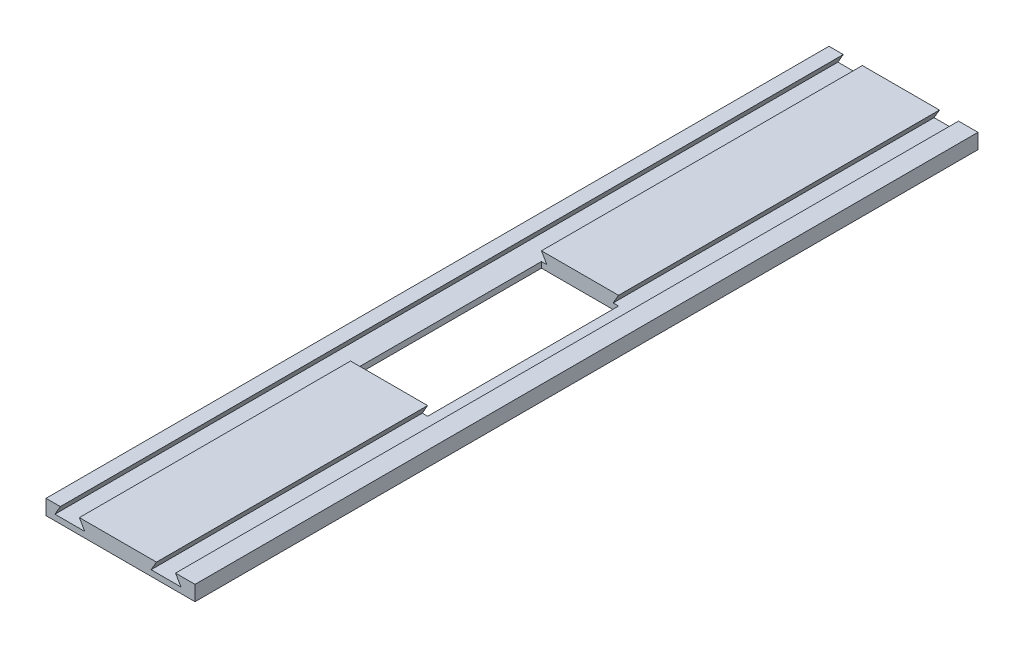
ISO-10303-21;
HEADER;
FILE_DESCRIPTION(('STEP AP214'),'2;1');
FILE_NAME('part.step','',(''),(''),'','','');
FILE_SCHEMA(('AUTOMOTIVE_DESIGN { 1 0 10303 214 1 1 1 1 }'));
ENDSEC;
DATA;
#1=APPLICATION_CONTEXT('core data for automotive mechanical design processes');
#2=APPLICATION_PROTOCOL_DEFINITION('international standard','automotive_design',2000,#1);
#3=PRODUCT_CONTEXT('',#1,'mechanical');
#4=PRODUCT('Part','Part','',(#3));
#5=PRODUCT_RELATED_PRODUCT_CATEGORY('part','',(#4));
#6=PRODUCT_DEFINITION_FORMATION('','',#4);
#7=PRODUCT_DEFINITION_CONTEXT('part definition',#1,'design');
#8=PRODUCT_DEFINITION('design','',#6,#7);
#9=PRODUCT_DEFINITION_SHAPE('','',#8);
#10=(LENGTH_UNIT() NAMED_UNIT(*) SI_UNIT(.MILLI.,.METRE.));
#11=(NAMED_UNIT(*) PLANE_ANGLE_UNIT() SI_UNIT($,.RADIAN.));
#12=(NAMED_UNIT(*) SI_UNIT($,.STERADIAN.) SOLID_ANGLE_UNIT());
#13=UNCERTAINTY_MEASURE_WITH_UNIT(LENGTH_MEASURE(1.E-05),#10,'distance_accuracy_value','');
#14=(GEOMETRIC_REPRESENTATION_CONTEXT(3) GLOBAL_UNCERTAINTY_ASSIGNED_CONTEXT((#13)) GLOBAL_UNIT_ASSIGNED_CONTEXT((#10,
#11,#12)) REPRESENTATION_CONTEXT('',''));
#15=CARTESIAN_POINT('',(0.,0.,0.));
#16=DIRECTION('',(0.,0.,1.));
#17=DIRECTION('',(1.,0.,0.));
#18=AXIS2_PLACEMENT_3D('',#15,#16,#17);
#19=CARTESIAN_POINT('',(-1225.05220386916,883.863170125017,150.));
#20=DIRECTION('',(-0.866025403784422,0.500000000000028,0.));
#21=DIRECTION('',(-0.500000000000028,-0.866025403784423,0.));
#22=AXIS2_PLACEMENT_3D('',#19,#20,#21);
#23=PLANE('',#22);
#24=DIRECTION('',(0.,0.,-1.));
#25=VECTOR('',#24,1.);
#26=CARTESIAN_POINT('',(-1224.15220386916,885.422015851829,150.));
#27=LINE('',#26,#25);
#28=CARTESIAN_POINT('',(-1224.15220386916,885.422015851829,53.8357045726677));
#29=VERTEX_POINT('',#28);
#30=CARTESIAN_POINT('',(-1224.15220386916,885.422015851829,0.));
#31=VERTEX_POINT('',#30);
#32=EDGE_CURVE('E211',#29,#31,#27,.T.);
#33=ORIENTED_EDGE('',*,*,#32,.F.);
#34=DIRECTION('',(-0.500000000000028,-0.866025403784423,0.));
#35=VECTOR('',#34,1.);
#36=CARTESIAN_POINT('',(-1225.05220386916,883.863170125017,53.8357045726677));
#37=LINE('',#36,#35);
#38=CARTESIAN_POINT('',(-1225.05220386916,883.863170125017,53.8357045726677));
#39=VERTEX_POINT('',#38);
#40=EDGE_CURVE('E273',#29,#39,#37,.T.);
#41=ORIENTED_EDGE('',*,*,#40,.T.);
#42=DIRECTION('',(0.,0.,-1.));
#43=VECTOR('',#42,1.);
#44=CARTESIAN_POINT('',(-1225.05220386916,883.863170125017,150.));
#45=LINE('',#44,#43);
#46=CARTESIAN_POINT('',(-1225.05220386916,883.863170125017,0.));
#47=VERTEX_POINT('',#46);
#48=EDGE_CURVE('E214',#39,#47,#45,.T.);
#49=ORIENTED_EDGE('',*,*,#48,.T.);
#50=DIRECTION('',(0.500000000000028,0.866025403784422,0.));
#51=VECTOR('',#50,1.);
#52=CARTESIAN_POINT('',(-1225.05220386916,883.863170125017,0.));
#53=LINE('',#52,#51);
#54=EDGE_CURVE('E299',#47,#31,#53,.T.);
#55=ORIENTED_EDGE('',*,*,#54,.T.);
#56=EDGE_LOOP('',(#33,#41,#49,#55));
#57=FACE_BOUND('',#56,.T.);
#58=ADVANCED_FACE('F39',(#57),#23,.F.);
#59=CARTESIAN_POINT('',(-1237.08617846537,885.422015851829,150.));
#60=DIRECTION('',(0.,-1.,0.));
#61=DIRECTION('',(0.,0.,-1.));
#62=AXIS2_PLACEMENT_3D('',#59,#60,#61);
#63=PLANE('',#62);
#64=DIRECTION('',(0.,0.,-1.));
#65=VECTOR('',#64,1.);
#66=CARTESIAN_POINT('',(-1237.08617846537,885.422015851829,150.));
#67=LINE('',#66,#65);
#68=CARTESIAN_POINT('',(-1237.08617846537,885.422015851829,53.8357045726677));
#69=VERTEX_POINT('',#68);
#70=CARTESIAN_POINT('',(-1237.08617846537,885.422015851829,0.));
#71=VERTEX_POINT('',#70);
#72=EDGE_CURVE('E208',#69,#71,#67,.T.);
#73=ORIENTED_EDGE('',*,*,#72,.F.);
#74=DIRECTION('',(-1.,0.,0.));
#75=VECTOR('',#74,1.);
#76=CARTESIAN_POINT('',(-1237.08617846537,885.422015851829,53.8357045726677));
#77=LINE('',#76,#75);
#78=EDGE_CURVE('E254',#29,#69,#77,.T.);
#79=ORIENTED_EDGE('',*,*,#78,.F.);
#80=ORIENTED_EDGE('',*,*,#32,.T.);
#81=DIRECTION('',(-1.,0.,0.));
#82=VECTOR('',#81,1.);
#83=CARTESIAN_POINT('',(-1237.08617846537,885.422015851829,0.));
#84=LINE('',#83,#82);
#85=EDGE_CURVE('E302',#31,#71,#84,.T.);
#86=ORIENTED_EDGE('',*,*,#85,.T.);
#87=EDGE_LOOP('',(#73,#79,#80,#86));
#88=FACE_BOUND('',#87,.T.);
#89=ADVANCED_FACE('F358',(#88),#63,.F.);
#90=CARTESIAN_POINT('',(-1236.18617846537,883.863170125017,150.));
#91=DIRECTION('',(0.866025403784422,0.500000000000028,0.));
#92=DIRECTION('',(-0.500000000000028,0.866025403784423,0.));
#93=AXIS2_PLACEMENT_3D('',#90,#91,#92);
#94=PLANE('',#93);
#95=DIRECTION('',(0.,0.,-1.));
#96=VECTOR('',#95,1.);
#97=CARTESIAN_POINT('',(-1236.18617846537,883.863170125017,150.));
#98=LINE('',#97,#96);
#99=CARTESIAN_POINT('',(-1236.18617846537,883.863170125017,53.8357045726677));
#100=VERTEX_POINT('',#99);
#101=CARTESIAN_POINT('',(-1236.18617846537,883.863170125017,0.));
#102=VERTEX_POINT('',#101);
#103=EDGE_CURVE('E205',#100,#102,#98,.T.);
#104=ORIENTED_EDGE('',*,*,#103,.F.);
#105=DIRECTION('',(-0.500000000000028,0.866025403784423,0.));
#106=VECTOR('',#105,1.);
#107=CARTESIAN_POINT('',(-1236.18617846537,883.863170125017,53.8357045726677));
#108=LINE('',#107,#106);
#109=EDGE_CURVE('E270',#100,#69,#108,.T.);
#110=ORIENTED_EDGE('',*,*,#109,.T.);
#111=ORIENTED_EDGE('',*,*,#72,.T.);
#112=DIRECTION('',(0.500000000000028,-0.866025403784422,0.));
#113=VECTOR('',#112,1.);
#114=CARTESIAN_POINT('',(-1236.18617846537,883.863170125017,0.));
#115=LINE('',#114,#113);
#116=EDGE_CURVE('E305',#71,#102,#115,.T.);
#117=ORIENTED_EDGE('',*,*,#116,.T.);
#118=EDGE_LOOP('',(#104,#110,#111,#117));
#119=FACE_BOUND('',#118,.T.);
#120=ADVANCED_FACE('F357',(#119),#94,.F.);
#121=CARTESIAN_POINT('',(-1242.68617846537,885.422015851829,150.));
#122=DIRECTION('',(1.,0.,0.));
#123=DIRECTION('',(0.,0.,-1.));
#124=AXIS2_PLACEMENT_3D('',#121,#122,#123);
#125=PLANE('',#124);
#126=DIRECTION('',(0.,0.,-1.));
#127=VECTOR('',#126,1.);
#128=CARTESIAN_POINT('',(-1242.68617846537,882.893470026503,150.));
#129=LINE('',#128,#127);
#130=CARTESIAN_POINT('',(-1242.68617846537,882.893470026503,131.36));
#131=VERTEX_POINT('',#130);
#132=CARTESIAN_POINT('',(-1242.68617846537,882.893470026503,0.));
#133=VERTEX_POINT('',#132);
#134=EDGE_CURVE('E189',#131,#133,#129,.T.);
#135=ORIENTED_EDGE('',*,*,#134,.F.);
#136=DIRECTION('',(0.,-1.,0.));
#137=VECTOR('',#136,1.);
#138=CARTESIAN_POINT('',(-1242.68617846537,885.422015851829,131.36));
#139=LINE('',#138,#137);
#140=CARTESIAN_POINT('',(-1242.68617846537,885.422015851829,131.36));
#141=VERTEX_POINT('',#140);
#142=EDGE_CURVE('E176',#141,#131,#139,.T.);
#143=ORIENTED_EDGE('',*,*,#142,.F.);
#144=DIRECTION('',(0.,0.,-1.));
#145=VECTOR('',#144,1.);
#146=CARTESIAN_POINT('',(-1242.68617846537,885.422015851829,150.));
#147=LINE('',#146,#145);
#148=CARTESIAN_POINT('',(-1242.68617846537,885.422015851829,0.));
#149=VERTEX_POINT('',#148);
#150=EDGE_CURVE('E187',#141,#149,#147,.T.);
#151=ORIENTED_EDGE('',*,*,#150,.T.);
#152=DIRECTION('',(0.,-1.,0.));
#153=VECTOR('',#152,1.);
#154=CARTESIAN_POINT('',(-1242.68617846537,885.422015851829,0.));
#155=LINE('',#154,#153);
#156=EDGE_CURVE('E282',#149,#133,#155,.T.);
#157=ORIENTED_EDGE('',*,*,#156,.T.);
#158=EDGE_LOOP('',(#135,#143,#151,#157));
#159=FACE_BOUND('',#158,.T.);
#160=ADVANCED_FACE('F41',(#159),#125,.F.);
#161=CARTESIAN_POINT('',(-1242.68617846537,882.893470026503,150.));
#162=DIRECTION('',(0.,1.,0.));
#163=DIRECTION('',(0.,0.,1.));
#164=AXIS2_PLACEMENT_3D('',#161,#162,#163);
#165=PLANE('',#164);
#166=DIRECTION('',(1.,0.,0.));
#167=VECTOR('',#166,1.);
#168=CARTESIAN_POINT('',(-1237.08617846537,882.893470026503,53.8357045726677));
#169=LINE('',#168,#167);
#170=CARTESIAN_POINT('',(-1237.08617846537,882.893470026503,53.8357045726677));
#171=VERTEX_POINT('',#170);
#172=CARTESIAN_POINT('',(-1224.15220386916,882.893470026503,53.8357045726677));
#173=VERTEX_POINT('',#172);
#174=EDGE_CURVE('E249',#171,#173,#169,.T.);
#175=ORIENTED_EDGE('',*,*,#174,.F.);
#176=DIRECTION('',(0.,0.,-1.));
#177=VECTOR('',#176,1.);
#178=CARTESIAN_POINT('',(-1237.08617846537,882.893470026503,85.8684548246354));
#179=LINE('',#178,#177);
#180=CARTESIAN_POINT('',(-1237.08617846537,882.893470026503,85.8684548246354));
#181=VERTEX_POINT('',#180);
#182=EDGE_CURVE('E243',#181,#171,#179,.T.);
#183=ORIENTED_EDGE('',*,*,#182,.F.);
#184=DIRECTION('',(-1.,0.,0.));
#185=VECTOR('',#184,1.);
#186=CARTESIAN_POINT('',(-1224.15220386916,882.893470026503,85.8684548246354));
#187=LINE('',#186,#185);
#188=CARTESIAN_POINT('',(-1224.15220386916,882.893470026503,85.8684548246354));
#189=VERTEX_POINT('',#188);
#190=EDGE_CURVE('E259',#189,#181,#187,.T.);
#191=ORIENTED_EDGE('',*,*,#190,.F.);
#192=DIRECTION('',(0.,0.,1.));
#193=VECTOR('',#192,1.);
#194=CARTESIAN_POINT('',(-1224.15220386916,882.893470026503,53.8357045726677));
#195=LINE('',#194,#193);
#196=EDGE_CURVE('E246',#173,#189,#195,.T.);
#197=ORIENTED_EDGE('',*,*,#196,.F.);
#198=EDGE_LOOP('',(#175,#183,#191,#197));
#199=FACE_BOUND('',#198,.T.);
#200=DIRECTION('',(0.,0.,-1.));
#201=VECTOR('',#200,1.);
#202=CARTESIAN_POINT('',(-1217.68617846537,882.893470026503,150.));
#203=LINE('',#202,#201);
#204=CARTESIAN_POINT('',(-1217.68617846537,882.893470026503,131.36));
#205=VERTEX_POINT('',#204);
#206=CARTESIAN_POINT('',(-1217.68617846537,882.893470026503,0.));
#207=VERTEX_POINT('',#206);
#208=EDGE_CURVE('E223',#205,#207,#203,.T.);
#209=ORIENTED_EDGE('',*,*,#208,.F.);
#210=DIRECTION('',(1.,0.,0.));
#211=VECTOR('',#210,1.);
#212=CARTESIAN_POINT('',(-1242.68617846537,882.893470026503,131.36));
#213=LINE('',#212,#211);
#214=EDGE_CURVE('E323',#131,#205,#213,.T.);
#215=ORIENTED_EDGE('',*,*,#214,.F.);
#216=ORIENTED_EDGE('',*,*,#134,.T.);
#217=DIRECTION('',(1.,0.,0.));
#218=VECTOR('',#217,1.);
#219=CARTESIAN_POINT('',(-1242.68617846537,882.893470026503,0.));
#220=LINE('',#219,#218);
#221=EDGE_CURVE('E284',#133,#207,#220,.T.);
#222=ORIENTED_EDGE('',*,*,#221,.T.);
#223=EDGE_LOOP('',(#209,#215,#216,#222));
#224=FACE_BOUND('',#223,.T.);
#225=ADVANCED_FACE('F322',(#199,#224),#165,.F.);
#226=CARTESIAN_POINT('',(-1217.68617846537,885.422015851829,150.));
#227=DIRECTION('',(-1.,0.,0.));
#228=DIRECTION('',(0.,0.,1.));
#229=AXIS2_PLACEMENT_3D('',#226,#227,#228);
#230=PLANE('',#229);
#231=DIRECTION('',(0.,0.,-1.));
#232=VECTOR('',#231,1.);
#233=CARTESIAN_POINT('',(-1217.68617846537,885.422015851829,150.));
#234=LINE('',#233,#232);
#235=CARTESIAN_POINT('',(-1217.68617846537,885.422015851829,131.36));
#236=VERTEX_POINT('',#235);
#237=CARTESIAN_POINT('',(-1217.68617846537,885.422015851829,0.));
#238=VERTEX_POINT('',#237);
#239=EDGE_CURVE('E221',#236,#238,#234,.T.);
#240=ORIENTED_EDGE('',*,*,#239,.F.);
#241=DIRECTION('',(0.,-1.,0.));
#242=VECTOR('',#241,1.);
#243=CARTESIAN_POINT('',(-1217.68617846537,885.422015851829,131.36));
#244=LINE('',#243,#242);
#245=EDGE_CURVE('E190',#236,#205,#244,.T.);
#246=ORIENTED_EDGE('',*,*,#245,.T.);
#247=ORIENTED_EDGE('',*,*,#208,.T.);
#248=DIRECTION('',(0.,1.,0.));
#249=VECTOR('',#248,1.);
#250=CARTESIAN_POINT('',(-1217.68617846537,885.422015851829,0.));
#251=LINE('',#250,#249);
#252=EDGE_CURVE('E287',#207,#238,#251,.T.);
#253=ORIENTED_EDGE('',*,*,#252,.T.);
#254=EDGE_LOOP('',(#240,#246,#247,#253));
#255=FACE_BOUND('',#254,.T.);
#256=ADVANCED_FACE('F384',(#255),#230,.F.);
#257=CARTESIAN_POINT('',(-1220.95220386916,885.422015851829,150.));
#258=DIRECTION('',(0.,-1.,0.));
#259=DIRECTION('',(0.,0.,-1.));
#260=AXIS2_PLACEMENT_3D('',#257,#258,#259);
#261=PLANE('',#260);
#262=DIRECTION('',(0.,0.,-1.));
#263=VECTOR('',#262,1.);
#264=CARTESIAN_POINT('',(-1220.95220386916,885.422015851829,150.));
#265=LINE('',#264,#263);
#266=CARTESIAN_POINT('',(-1220.95220386916,885.422015851829,131.36));
#267=VERTEX_POINT('',#266);
#268=CARTESIAN_POINT('',(-1220.95220386916,885.422015851829,0.));
#269=VERTEX_POINT('',#268);
#270=EDGE_CURVE('E219',#267,#269,#265,.T.);
#271=ORIENTED_EDGE('',*,*,#270,.F.);
#272=DIRECTION('',(1.,0.,0.));
#273=VECTOR('',#272,1.);
#274=CARTESIAN_POINT('',(-1242.68617846537,885.422015851829,131.36));
#275=LINE('',#274,#273);
#276=EDGE_CURVE('E183',#267,#236,#275,.T.);
#277=ORIENTED_EDGE('',*,*,#276,.T.);
#278=ORIENTED_EDGE('',*,*,#239,.T.);
#279=DIRECTION('',(-1.,0.,0.));
#280=VECTOR('',#279,1.);
#281=CARTESIAN_POINT('',(-1220.95220386916,885.422015851829,0.));
#282=LINE('',#281,#280);
#283=EDGE_CURVE('E290',#238,#269,#282,.T.);
#284=ORIENTED_EDGE('',*,*,#283,.T.);
#285=EDGE_LOOP('',(#271,#277,#278,#284));
#286=FACE_BOUND('',#285,.T.);
#287=ADVANCED_FACE('F389',(#286),#261,.F.);
#288=CARTESIAN_POINT('',(-1220.95220386916,885.422015851829,150.));
#289=DIRECTION('',(0.866025403784422,0.500000000000028,0.));
#290=DIRECTION('',(-0.500000000000028,0.866025403784423,0.));
#291=AXIS2_PLACEMENT_3D('',#288,#289,#290);
#292=PLANE('',#291);
#293=DIRECTION('',(0.,0.,-1.));
#294=VECTOR('',#293,1.);
#295=CARTESIAN_POINT('',(-1220.05220386916,883.863170125017,150.));
#296=LINE('',#295,#294);
#297=CARTESIAN_POINT('',(-1220.05220386916,883.863170125017,131.36));
#298=VERTEX_POINT('',#297);
#299=CARTESIAN_POINT('',(-1220.05220386916,883.863170125017,0.));
#300=VERTEX_POINT('',#299);
#301=EDGE_CURVE('E217',#298,#300,#296,.T.);
#302=ORIENTED_EDGE('',*,*,#301,.F.);
#303=DIRECTION('',(-0.500000000000028,0.866025403784423,0.));
#304=VECTOR('',#303,1.);
#305=CARTESIAN_POINT('',(-1220.95220386916,885.422015851829,131.36));
#306=LINE('',#305,#304);
#307=EDGE_CURVE('E342',#298,#267,#306,.T.);
#308=ORIENTED_EDGE('',*,*,#307,.T.);
#309=ORIENTED_EDGE('',*,*,#270,.T.);
#310=DIRECTION('',(0.500000000000028,-0.866025403784422,0.));
#311=VECTOR('',#310,1.);
#312=CARTESIAN_POINT('',(-1220.95220386916,885.422015851829,0.));
#313=LINE('',#312,#311);
#314=EDGE_CURVE('E293',#269,#300,#313,.T.);
#315=ORIENTED_EDGE('',*,*,#314,.T.);
#316=EDGE_LOOP('',(#302,#308,#309,#315));
#317=FACE_BOUND('',#316,.T.);
#318=ADVANCED_FACE('F406',(#317),#292,.F.);
#319=CARTESIAN_POINT('',(-1220.05220386916,883.863170125017,150.));
#320=DIRECTION('',(0.,-1.,0.));
#321=DIRECTION('',(0.,0.,-1.));
#322=AXIS2_PLACEMENT_3D('',#319,#320,#321);
#323=PLANE('',#322);
#324=CARTESIAN_POINT('',(-1225.05220386916,883.863170125017,131.36));
#325=VERTEX_POINT('',#324);
#326=CARTESIAN_POINT('',(-1225.05220386916,883.863170125017,85.8684548246354));
#327=VERTEX_POINT('',#326);
#328=EDGE_CURVE('E215',#325,#327,#45,.T.);
#329=ORIENTED_EDGE('',*,*,#328,.F.);
#330=DIRECTION('',(1.,0.,0.));
#331=VECTOR('',#330,1.);
#332=CARTESIAN_POINT('',(-1220.05220386916,883.863170125017,131.36));
#333=LINE('',#332,#331);
#334=EDGE_CURVE('E339',#325,#298,#333,.T.);
#335=ORIENTED_EDGE('',*,*,#334,.T.);
#336=ORIENTED_EDGE('',*,*,#301,.T.);
#337=DIRECTION('',(-1.,0.,0.));
#338=VECTOR('',#337,1.);
#339=CARTESIAN_POINT('',(-1220.05220386916,883.863170125017,0.));
#340=LINE('',#339,#338);
#341=EDGE_CURVE('E296',#300,#47,#340,.T.);
#342=ORIENTED_EDGE('',*,*,#341,.T.);
#343=ORIENTED_EDGE('',*,*,#48,.F.);
#344=DIRECTION('',(1.,0.,0.));
#345=VECTOR('',#344,1.);
#346=CARTESIAN_POINT('',(-1220.05220386916,883.863170125017,53.8357045726677));
#347=LINE('',#346,#345);
#348=CARTESIAN_POINT('',(-1224.15220386916,883.863170125017,53.8357045726677));
#349=VERTEX_POINT('',#348);
#350=EDGE_CURVE('E276',#39,#349,#347,.T.);
#351=ORIENTED_EDGE('',*,*,#350,.T.);
#352=DIRECTION('',(0.,0.,1.));
#353=VECTOR('',#352,1.);
#354=CARTESIAN_POINT('',(-1224.15220386916,883.863170125017,150.));
#355=LINE('',#354,#353);
#356=CARTESIAN_POINT('',(-1224.15220386916,883.863170125017,85.8684548246354));
#357=VERTEX_POINT('',#356);
#358=EDGE_CURVE('E279',#349,#357,#355,.T.);
#359=ORIENTED_EDGE('',*,*,#358,.T.);
#360=DIRECTION('',(-1.,0.,0.));
#361=VECTOR('',#360,1.);
#362=CARTESIAN_POINT('',(-1220.05220386916,883.863170125017,85.8684548246354));
#363=LINE('',#362,#361);
#364=EDGE_CURVE('E267',#357,#327,#363,.T.);
#365=ORIENTED_EDGE('',*,*,#364,.T.);
#366=EDGE_LOOP('',(#329,#335,#336,#342,#343,#351,#359,#365));
#367=FACE_BOUND('',#366,.T.);
#368=ADVANCED_FACE('F375',(#367),#323,.F.);
#369=CARTESIAN_POINT('',(-1224.15220386916,885.422015851829,131.36));
#370=VERTEX_POINT('',#369);
#371=CARTESIAN_POINT('',(-1224.15220386916,885.422015851829,85.8684548246354));
#372=VERTEX_POINT('',#371);
#373=EDGE_CURVE('E212',#370,#372,#27,.T.);
#374=ORIENTED_EDGE('',*,*,#373,.F.);
#375=DIRECTION('',(-0.500000000000028,-0.866025403784423,0.));
#376=VECTOR('',#375,1.);
#377=CARTESIAN_POINT('',(-1225.05220386916,883.863170125017,131.36));
#378=LINE('',#377,#376);
#379=EDGE_CURVE('E336',#370,#325,#378,.T.);
#380=ORIENTED_EDGE('',*,*,#379,.T.);
#381=ORIENTED_EDGE('',*,*,#328,.T.);
#382=DIRECTION('',(0.500000000000028,0.866025403784423,0.));
#383=VECTOR('',#382,1.);
#384=CARTESIAN_POINT('',(-1225.05220386916,883.863170125017,85.8684548246354));
#385=LINE('',#384,#383);
#386=EDGE_CURVE('E264',#327,#372,#385,.T.);
#387=ORIENTED_EDGE('',*,*,#386,.T.);
#388=EDGE_LOOP('',(#374,#380,#381,#387));
#389=FACE_BOUND('',#388,.T.);
#390=ADVANCED_FACE('F372',(#389),#23,.F.);
#391=CARTESIAN_POINT('',(-1237.08617846537,885.422015851829,131.36));
#392=VERTEX_POINT('',#391);
#393=CARTESIAN_POINT('',(-1237.08617846537,885.422015851829,85.8684548246354));
#394=VERTEX_POINT('',#393);
#395=EDGE_CURVE('E209',#392,#394,#67,.T.);
#396=ORIENTED_EDGE('',*,*,#395,.F.);
#397=EDGE_CURVE('E181',#392,#370,#275,.T.);
#398=ORIENTED_EDGE('',*,*,#397,.T.);
#399=ORIENTED_EDGE('',*,*,#373,.T.);
#400=DIRECTION('',(1.,0.,0.));
#401=VECTOR('',#400,1.);
#402=CARTESIAN_POINT('',(-1224.15220386916,885.422015851829,85.8684548246354));
#403=LINE('',#402,#401);
#404=EDGE_CURVE('E344',#394,#372,#403,.T.);
#405=ORIENTED_EDGE('',*,*,#404,.F.);
#406=EDGE_LOOP('',(#396,#398,#399,#405));
#407=FACE_BOUND('',#406,.T.);
#408=ADVANCED_FACE('F368',(#407),#63,.F.);
#409=CARTESIAN_POINT('',(-1236.18617846537,883.863170125017,131.36));
#410=VERTEX_POINT('',#409);
#411=CARTESIAN_POINT('',(-1236.18617846537,883.863170125017,85.8684548246354));
#412=VERTEX_POINT('',#411);
#413=EDGE_CURVE('E206',#410,#412,#98,.T.);
#414=ORIENTED_EDGE('',*,*,#413,.F.);
#415=DIRECTION('',(-0.500000000000028,0.866025403784423,0.));
#416=VECTOR('',#415,1.);
#417=CARTESIAN_POINT('',(-1236.18617846537,883.863170125017,131.36));
#418=LINE('',#417,#416);
#419=EDGE_CURVE('E333',#410,#392,#418,.T.);
#420=ORIENTED_EDGE('',*,*,#419,.T.);
#421=ORIENTED_EDGE('',*,*,#395,.T.);
#422=DIRECTION('',(0.500000000000028,-0.866025403784423,0.));
#423=VECTOR('',#422,1.);
#424=CARTESIAN_POINT('',(-1236.18617846537,883.863170125017,85.8684548246354));
#425=LINE('',#424,#423);
#426=EDGE_CURVE('E261',#394,#412,#425,.T.);
#427=ORIENTED_EDGE('',*,*,#426,.T.);
#428=EDGE_LOOP('',(#414,#420,#421,#427));
#429=FACE_BOUND('',#428,.T.);
#430=ADVANCED_FACE('F364',(#429),#94,.F.);
#431=CARTESIAN_POINT('',(-1241.18617846537,883.863170125017,150.));
#432=DIRECTION('',(0.,-1.,0.));
#433=DIRECTION('',(0.,0.,-1.));
#434=AXIS2_PLACEMENT_3D('',#431,#432,#433);
#435=PLANE('',#434);
#436=DIRECTION('',(0.,0.,-1.));
#437=VECTOR('',#436,1.);
#438=CARTESIAN_POINT('',(-1241.18617846537,883.863170125017,150.));
#439=LINE('',#438,#437);
#440=CARTESIAN_POINT('',(-1241.18617846537,883.863170125017,131.36));
#441=VERTEX_POINT('',#440);
#442=CARTESIAN_POINT('',(-1241.18617846537,883.863170125017,0.));
#443=VERTEX_POINT('',#442);
#444=EDGE_CURVE('E198',#441,#443,#439,.T.);
#445=ORIENTED_EDGE('',*,*,#444,.F.);
#446=DIRECTION('',(1.,0.,0.));
#447=VECTOR('',#446,1.);
#448=CARTESIAN_POINT('',(-1241.18617846537,883.863170125017,131.36));
#449=LINE('',#448,#447);
#450=EDGE_CURVE('E330',#441,#410,#449,.T.);
#451=ORIENTED_EDGE('',*,*,#450,.T.);
#452=ORIENTED_EDGE('',*,*,#413,.T.);
#453=DIRECTION('',(-1.,0.,0.));
#454=VECTOR('',#453,1.);
#455=CARTESIAN_POINT('',(-1241.18617846537,883.863170125017,85.8684548246354));
#456=LINE('',#455,#454);
#457=CARTESIAN_POINT('',(-1237.08617846537,883.863170125017,85.8684548246354));
#458=VERTEX_POINT('',#457);
#459=EDGE_CURVE('E226',#412,#458,#456,.T.);
#460=ORIENTED_EDGE('',*,*,#459,.T.);
#461=DIRECTION('',(0.,0.,-1.));
#462=VECTOR('',#461,1.);
#463=CARTESIAN_POINT('',(-1237.08617846537,883.863170125017,150.));
#464=LINE('',#463,#462);
#465=CARTESIAN_POINT('',(-1237.08617846537,883.863170125017,53.8357045726677));
#466=VERTEX_POINT('',#465);
#467=EDGE_CURVE('E47',#458,#466,#464,.T.);
#468=ORIENTED_EDGE('',*,*,#467,.T.);
#469=DIRECTION('',(1.,0.,0.));
#470=VECTOR('',#469,1.);
#471=CARTESIAN_POINT('',(-1241.18617846537,883.863170125017,53.8357045726677));
#472=LINE('',#471,#470);
#473=EDGE_CURVE('E11',#466,#100,#472,.T.);
#474=ORIENTED_EDGE('',*,*,#473,.T.);
#475=ORIENTED_EDGE('',*,*,#103,.T.);
#476=DIRECTION('',(-1.,0.,0.));
#477=VECTOR('',#476,1.);
#478=CARTESIAN_POINT('',(-1241.18617846537,883.863170125017,0.));
#479=LINE('',#478,#477);
#480=EDGE_CURVE('E308',#102,#443,#479,.T.);
#481=ORIENTED_EDGE('',*,*,#480,.T.);
#482=EDGE_LOOP('',(#445,#451,#452,#460,#468,#474,#475,#481));
#483=FACE_BOUND('',#482,.T.);
#484=ADVANCED_FACE('F232',(#483),#435,.F.);
#485=CARTESIAN_POINT('',(-1240.28617846537,885.422015851829,150.));
#486=DIRECTION('',(-0.866025403784422,0.500000000000028,0.));
#487=DIRECTION('',(-0.500000000000028,-0.866025403784423,0.));
#488=AXIS2_PLACEMENT_3D('',#485,#486,#487);
#489=PLANE('',#488);
#490=DIRECTION('',(0.,0.,-1.));
#491=VECTOR('',#490,1.);
#492=CARTESIAN_POINT('',(-1240.28617846537,885.422015851829,150.));
#493=LINE('',#492,#491);
#494=CARTESIAN_POINT('',(-1240.28617846537,885.422015851829,131.36));
#495=VERTEX_POINT('',#494);
#496=CARTESIAN_POINT('',(-1240.28617846537,885.422015851829,0.));
#497=VERTEX_POINT('',#496);
#498=EDGE_CURVE('E196',#495,#497,#493,.T.);
#499=ORIENTED_EDGE('',*,*,#498,.F.);
#500=DIRECTION('',(-0.500000000000028,-0.866025403784423,0.));
#501=VECTOR('',#500,1.);
#502=CARTESIAN_POINT('',(-1240.28617846537,885.422015851829,131.36));
#503=LINE('',#502,#501);
#504=EDGE_CURVE('E54',#495,#441,#503,.T.);
#505=ORIENTED_EDGE('',*,*,#504,.T.);
#506=ORIENTED_EDGE('',*,*,#444,.T.);
#507=DIRECTION('',(0.500000000000028,0.866025403784422,0.));
#508=VECTOR('',#507,1.);
#509=CARTESIAN_POINT('',(-1240.28617846537,885.422015851829,0.));
#510=LINE('',#509,#508);
#511=EDGE_CURVE('E200',#443,#497,#510,.T.);
#512=ORIENTED_EDGE('',*,*,#511,.T.);
#513=EDGE_LOOP('',(#499,#505,#506,#512));
#514=FACE_BOUND('',#513,.T.);
#515=ADVANCED_FACE('F313',(#514),#489,.F.);
#516=CARTESIAN_POINT('',(-1242.68617846537,885.422015851829,150.));
#517=DIRECTION('',(0.,-1.,0.));
#518=DIRECTION('',(0.,0.,-1.));
#519=AXIS2_PLACEMENT_3D('',#516,#517,#518);
#520=PLANE('',#519);
#521=ORIENTED_EDGE('',*,*,#150,.F.);
#522=EDGE_CURVE('E173',#141,#495,#275,.T.);
#523=ORIENTED_EDGE('',*,*,#522,.T.);
#524=ORIENTED_EDGE('',*,*,#498,.T.);
#525=DIRECTION('',(-1.,0.,0.));
#526=VECTOR('',#525,1.);
#527=CARTESIAN_POINT('',(-1242.68617846537,885.422015851829,0.));
#528=LINE('',#527,#526);
#529=EDGE_CURVE('E194',#497,#149,#528,.T.);
#530=ORIENTED_EDGE('',*,*,#529,.T.);
#531=EDGE_LOOP('',(#521,#523,#524,#530));
#532=FACE_BOUND('',#531,.T.);
#533=ADVANCED_FACE('F192',(#532),#520,.F.);
#534=CARTESIAN_POINT('',(0.,0.,0.));
#535=DIRECTION('',(0.,0.,1.));
#536=DIRECTION('',(1.,0.,0.));
#537=AXIS2_PLACEMENT_3D('',#534,#535,#536);
#538=PLANE('',#537);
#539=ORIENTED_EDGE('',*,*,#156,.F.);
#540=ORIENTED_EDGE('',*,*,#529,.F.);
#541=ORIENTED_EDGE('',*,*,#511,.F.);
#542=ORIENTED_EDGE('',*,*,#480,.F.);
#543=ORIENTED_EDGE('',*,*,#116,.F.);
#544=ORIENTED_EDGE('',*,*,#85,.F.);
#545=ORIENTED_EDGE('',*,*,#54,.F.);
#546=ORIENTED_EDGE('',*,*,#341,.F.);
#547=ORIENTED_EDGE('',*,*,#314,.F.);
#548=ORIENTED_EDGE('',*,*,#283,.F.);
#549=ORIENTED_EDGE('',*,*,#252,.F.);
#550=ORIENTED_EDGE('',*,*,#221,.F.);
#551=EDGE_LOOP('',(#539,#540,#541,#542,#543,#544,#545,#546,#547,#548,#549,#550));
#552=FACE_BOUND('',#551,.T.);
#553=ADVANCED_FACE('F316',(#552),#538,.F.);
#554=CARTESIAN_POINT('',(-1224.15220386916,848.348068197019,53.8357045726677));
#555=DIRECTION('',(1.,0.,0.));
#556=DIRECTION('',(0.,0.,-1.));
#557=AXIS2_PLACEMENT_3D('',#554,#555,#556);
#558=PLANE('',#557);
#559=DIRECTION('',(0.,1.,0.));
#560=VECTOR('',#559,1.);
#561=CARTESIAN_POINT('',(-1224.15220386916,848.348068197019,53.8357045726677));
#562=LINE('',#561,#560);
#563=EDGE_CURVE('E247',#173,#349,#562,.T.);
#564=ORIENTED_EDGE('',*,*,#563,.F.);
#565=ORIENTED_EDGE('',*,*,#196,.T.);
#566=DIRECTION('',(0.,1.,0.));
#567=VECTOR('',#566,1.);
#568=CARTESIAN_POINT('',(-1224.15220386916,848.348068197019,85.8684548246354));
#569=LINE('',#568,#567);
#570=EDGE_CURVE('E62',#189,#357,#569,.T.);
#571=ORIENTED_EDGE('',*,*,#570,.T.);
#572=ORIENTED_EDGE('',*,*,#358,.F.);
#573=EDGE_LOOP('',(#564,#565,#571,#572));
#574=FACE_BOUND('',#573,.T.);
#575=ADVANCED_FACE('F379',(#574),#558,.F.);
#576=CARTESIAN_POINT('',(-1237.08617846537,848.348068197019,85.8684548246354));
#577=DIRECTION('',(-1.,0.,0.));
#578=DIRECTION('',(0.,0.,1.));
#579=AXIS2_PLACEMENT_3D('',#576,#577,#578);
#580=PLANE('',#579);
#581=DIRECTION('',(0.,1.,0.));
#582=VECTOR('',#581,1.);
#583=CARTESIAN_POINT('',(-1237.08617846537,848.348068197019,85.8684548246354));
#584=LINE('',#583,#582);
#585=EDGE_CURVE('E239',#181,#458,#584,.T.);
#586=ORIENTED_EDGE('',*,*,#585,.F.);
#587=ORIENTED_EDGE('',*,*,#182,.T.);
#588=DIRECTION('',(0.,1.,0.));
#589=VECTOR('',#588,1.);
#590=CARTESIAN_POINT('',(-1237.08617846537,848.348068197019,53.8357045726677));
#591=LINE('',#590,#589);
#592=EDGE_CURVE('E242',#171,#466,#591,.T.);
#593=ORIENTED_EDGE('',*,*,#592,.T.);
#594=ORIENTED_EDGE('',*,*,#467,.F.);
#595=EDGE_LOOP('',(#586,#587,#593,#594));
#596=FACE_BOUND('',#595,.T.);
#597=ADVANCED_FACE('F238',(#596),#580,.F.);
#598=CARTESIAN_POINT('',(-1237.08617846537,848.348068197019,53.8357045726677));
#599=DIRECTION('',(0.,0.,-1.));
#600=DIRECTION('',(-1.,0.,0.));
#601=AXIS2_PLACEMENT_3D('',#598,#599,#600);
#602=PLANE('',#601);
#603=ORIENTED_EDGE('',*,*,#40,.F.);
#604=ORIENTED_EDGE('',*,*,#78,.T.);
#605=ORIENTED_EDGE('',*,*,#109,.F.);
#606=ORIENTED_EDGE('',*,*,#473,.F.);
#607=ORIENTED_EDGE('',*,*,#592,.F.);
#608=ORIENTED_EDGE('',*,*,#174,.T.);
#609=ORIENTED_EDGE('',*,*,#563,.T.);
#610=ORIENTED_EDGE('',*,*,#350,.F.);
#611=EDGE_LOOP('',(#603,#604,#605,#606,#607,#608,#609,#610));
#612=FACE_BOUND('',#611,.T.);
#613=ADVANCED_FACE('F352',(#612),#602,.F.);
#614=CARTESIAN_POINT('',(-1224.15220386916,848.348068197019,85.8684548246354));
#615=DIRECTION('',(0.,0.,1.));
#616=DIRECTION('',(1.,0.,0.));
#617=AXIS2_PLACEMENT_3D('',#614,#615,#616);
#618=PLANE('',#617);
#619=ORIENTED_EDGE('',*,*,#570,.F.);
#620=ORIENTED_EDGE('',*,*,#190,.T.);
#621=ORIENTED_EDGE('',*,*,#585,.T.);
#622=ORIENTED_EDGE('',*,*,#459,.F.);
#623=ORIENTED_EDGE('',*,*,#426,.F.);
#624=ORIENTED_EDGE('',*,*,#404,.T.);
#625=ORIENTED_EDGE('',*,*,#386,.F.);
#626=ORIENTED_EDGE('',*,*,#364,.F.);
#627=EDGE_LOOP('',(#619,#620,#621,#622,#623,#624,#625,#626));
#628=FACE_BOUND('',#627,.T.);
#629=ADVANCED_FACE('F366',(#628),#618,.F.);
#630=CARTESIAN_POINT('',(-1242.68617846537,885.422015851829,131.36));
#631=DIRECTION('',(0.,0.,-1.));
#632=DIRECTION('',(-1.,0.,0.));
#633=AXIS2_PLACEMENT_3D('',#630,#631,#632);
#634=PLANE('',#633);
#635=ORIENTED_EDGE('',*,*,#334,.F.);
#636=ORIENTED_EDGE('',*,*,#379,.F.);
#637=ORIENTED_EDGE('',*,*,#397,.F.);
#638=ORIENTED_EDGE('',*,*,#419,.F.);
#639=ORIENTED_EDGE('',*,*,#450,.F.);
#640=ORIENTED_EDGE('',*,*,#504,.F.);
#641=ORIENTED_EDGE('',*,*,#522,.F.);
#642=ORIENTED_EDGE('',*,*,#142,.T.);
#643=ORIENTED_EDGE('',*,*,#214,.T.);
#644=ORIENTED_EDGE('',*,*,#245,.F.);
#645=ORIENTED_EDGE('',*,*,#276,.F.);
#646=ORIENTED_EDGE('',*,*,#307,.F.);
#647=EDGE_LOOP('',(#635,#636,#637,#638,#639,#640,#641,#642,#643,#644,#645,#646));
#648=FACE_BOUND('',#647,.T.);
#649=ADVANCED_FACE('F175',(#648),#634,.F.);
#650=CLOSED_SHELL('',(#58,#89,#120,#160,#225,#256,#287,#318,#368,#390,#408,#430,#484,#515,#533,
#553,#575,#597,#613,#629,#649));
#651=MANIFOLD_SOLID_BREP('B2',#650);
#652=ADVANCED_BREP_SHAPE_REPRESENTATION('',(#18,#651),#14);
#653=SHAPE_DEFINITION_REPRESENTATION(#9,#652);
ENDSEC;
END-ISO-10303-21;
